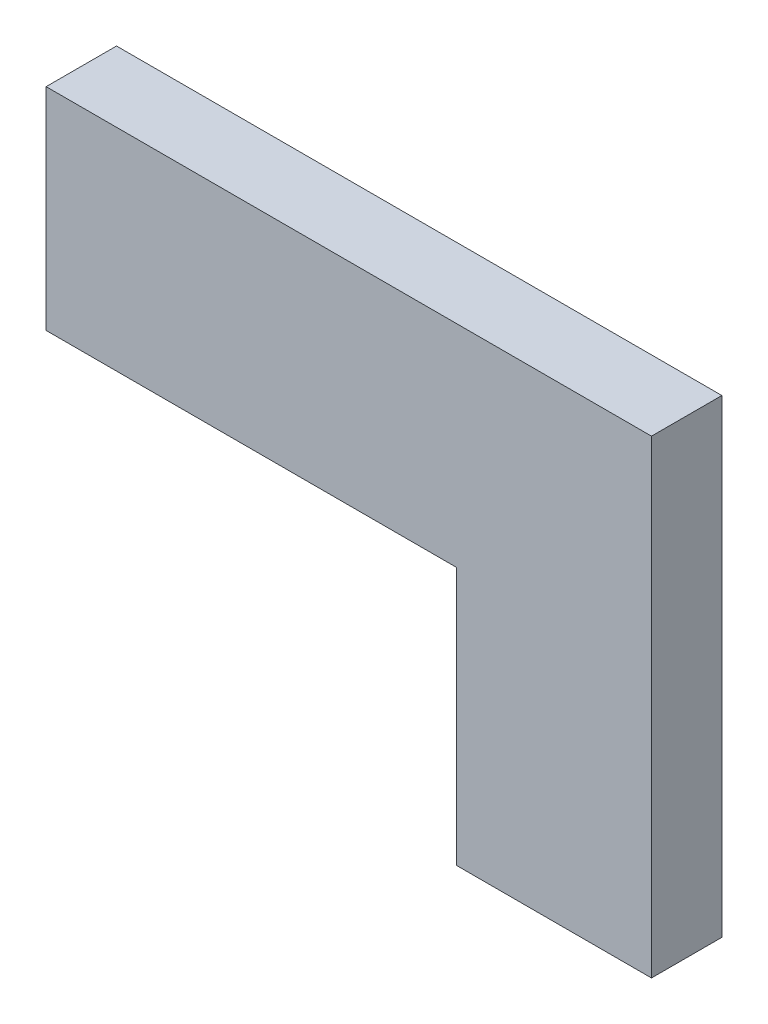
ISO-10303-21;
HEADER;
FILE_DESCRIPTION(('STEP AP214'),'2;1');
FILE_NAME('part.step','',(''),(''),'','','');
FILE_SCHEMA(('AUTOMOTIVE_DESIGN { 1 0 10303 214 1 1 1 1 }'));
ENDSEC;
DATA;
#1=APPLICATION_CONTEXT('core data for automotive mechanical design processes');
#2=APPLICATION_PROTOCOL_DEFINITION('international standard','automotive_design',2000,#1);
#3=PRODUCT_CONTEXT('',#1,'mechanical');
#4=PRODUCT('Part','Part','',(#3));
#5=PRODUCT_RELATED_PRODUCT_CATEGORY('part','',(#4));
#6=PRODUCT_DEFINITION_FORMATION('','',#4);
#7=PRODUCT_DEFINITION_CONTEXT('part definition',#1,'design');
#8=PRODUCT_DEFINITION('design','',#6,#7);
#9=PRODUCT_DEFINITION_SHAPE('','',#8);
#10=(LENGTH_UNIT() NAMED_UNIT(*) SI_UNIT(.MILLI.,.METRE.));
#11=(NAMED_UNIT(*) PLANE_ANGLE_UNIT() SI_UNIT($,.RADIAN.));
#12=(NAMED_UNIT(*) SI_UNIT($,.STERADIAN.) SOLID_ANGLE_UNIT());
#13=UNCERTAINTY_MEASURE_WITH_UNIT(LENGTH_MEASURE(1.E-05),#10,'distance_accuracy_value','');
#14=(GEOMETRIC_REPRESENTATION_CONTEXT(3) GLOBAL_UNCERTAINTY_ASSIGNED_CONTEXT((#13)) GLOBAL_UNIT_ASSIGNED_CONTEXT((#10,
#11,#12)) REPRESENTATION_CONTEXT('',''));
#15=CARTESIAN_POINT('',(0.,0.,0.));
#16=DIRECTION('',(0.,0.,1.));
#17=DIRECTION('',(1.,0.,0.));
#18=AXIS2_PLACEMENT_3D('',#15,#16,#17);
#19=CARTESIAN_POINT('',(-2.50000000000001,202.5,356.441418940673));
#20=DIRECTION('',(1.,0.,0.));
#21=DIRECTION('',(0.,1.,0.));
#22=AXIS2_PLACEMENT_3D('',#19,#20,#21);
#23=PLANE('',#22);
#24=DIRECTION('',(0.,-1.,0.));
#25=VECTOR('',#24,1.);
#26=CARTESIAN_POINT('',(-2.50000000000001,202.5,30.));
#27=LINE('',#26,#25);
#28=CARTESIAN_POINT('',(-2.50000000000001,202.5,30.));
#29=VERTEX_POINT('',#28);
#30=CARTESIAN_POINT('',(-2.5,112.5,30.));
#31=VERTEX_POINT('',#30);
#32=EDGE_CURVE('E114',#29,#31,#27,.T.);
#33=ORIENTED_EDGE('',*,*,#32,.F.);
#34=DIRECTION('',(0.,0.,-1.));
#35=VECTOR('',#34,1.);
#36=CARTESIAN_POINT('',(-2.50000000000001,202.5,356.441418940673));
#37=LINE('',#36,#35);
#38=CARTESIAN_POINT('',(-2.50000000000001,202.5,0.));
#39=VERTEX_POINT('',#38);
#40=EDGE_CURVE('E37',#29,#39,#37,.T.);
#41=ORIENTED_EDGE('',*,*,#40,.T.);
#42=DIRECTION('',(0.,-1.,0.));
#43=VECTOR('',#42,1.);
#44=CARTESIAN_POINT('',(-2.50000000000001,202.5,0.));
#45=LINE('',#44,#43);
#46=CARTESIAN_POINT('',(-2.5,112.5,0.));
#47=VERTEX_POINT('',#46);
#48=EDGE_CURVE('E122',#39,#47,#45,.T.);
#49=ORIENTED_EDGE('',*,*,#48,.T.);
#50=DIRECTION('',(0.,0.,-1.));
#51=VECTOR('',#50,1.);
#52=CARTESIAN_POINT('',(-2.5,112.5,356.441418940673));
#53=LINE('',#52,#51);
#54=EDGE_CURVE('E80',#31,#47,#53,.T.);
#55=ORIENTED_EDGE('',*,*,#54,.F.);
#56=EDGE_LOOP('',(#33,#41,#49,#55));
#57=FACE_BOUND('',#56,.T.);
#58=ADVANCED_FACE('F33',(#57),#23,.F.);
#59=CARTESIAN_POINT('',(-2.5,112.5,356.441418940673));
#60=DIRECTION('',(0.,1.,0.));
#61=DIRECTION('',(0.,0.,1.));
#62=AXIS2_PLACEMENT_3D('',#59,#60,#61);
#63=PLANE('',#62);
#64=DIRECTION('',(1.,0.,0.));
#65=VECTOR('',#64,1.);
#66=CARTESIAN_POINT('',(-2.5,112.5,30.));
#67=LINE('',#66,#65);
#68=CARTESIAN_POINT('',(172.5,112.5,30.));
#69=VERTEX_POINT('',#68);
#70=EDGE_CURVE('E87',#31,#69,#67,.T.);
#71=ORIENTED_EDGE('',*,*,#70,.F.);
#72=ORIENTED_EDGE('',*,*,#54,.T.);
#73=DIRECTION('',(1.,0.,0.));
#74=VECTOR('',#73,1.);
#75=CARTESIAN_POINT('',(-2.5,112.5,0.));
#76=LINE('',#75,#74);
#77=CARTESIAN_POINT('',(172.5,112.5,0.));
#78=VERTEX_POINT('',#77);
#79=EDGE_CURVE('E121',#47,#78,#76,.T.);
#80=ORIENTED_EDGE('',*,*,#79,.T.);
#81=DIRECTION('',(0.,0.,-1.));
#82=VECTOR('',#81,1.);
#83=CARTESIAN_POINT('',(172.5,112.5,356.441418940673));
#84=LINE('',#83,#82);
#85=EDGE_CURVE('E123',#69,#78,#84,.T.);
#86=ORIENTED_EDGE('',*,*,#85,.F.);
#87=EDGE_LOOP('',(#71,#72,#80,#86));
#88=FACE_BOUND('',#87,.T.);
#89=ADVANCED_FACE('F141',(#88),#63,.F.);
#90=CARTESIAN_POINT('',(172.5,2.50000000000002,356.441418940673));
#91=DIRECTION('',(1.,0.,0.));
#92=DIRECTION('',(0.,0.,-1.));
#93=AXIS2_PLACEMENT_3D('',#90,#91,#92);
#94=PLANE('',#93);
#95=DIRECTION('',(0.,-1.,0.));
#96=VECTOR('',#95,1.);
#97=CARTESIAN_POINT('',(172.5,2.50000000000006,30.));
#98=LINE('',#97,#96);
#99=CARTESIAN_POINT('',(172.5,2.50000000000002,30.));
#100=VERTEX_POINT('',#99);
#101=EDGE_CURVE('E108',#69,#100,#98,.T.);
#102=ORIENTED_EDGE('',*,*,#101,.F.);
#103=ORIENTED_EDGE('',*,*,#85,.T.);
#104=DIRECTION('',(0.,-1.,0.));
#105=VECTOR('',#104,1.);
#106=CARTESIAN_POINT('',(172.5,2.50000000000002,0.));
#107=LINE('',#106,#105);
#108=CARTESIAN_POINT('',(172.5,2.50000000000002,0.));
#109=VERTEX_POINT('',#108);
#110=EDGE_CURVE('E125',#78,#109,#107,.T.);
#111=ORIENTED_EDGE('',*,*,#110,.T.);
#112=DIRECTION('',(0.,0.,-1.));
#113=VECTOR('',#112,1.);
#114=CARTESIAN_POINT('',(172.5,2.50000000000002,356.441418940673));
#115=LINE('',#114,#113);
#116=EDGE_CURVE('E126',#100,#109,#115,.T.);
#117=ORIENTED_EDGE('',*,*,#116,.F.);
#118=EDGE_LOOP('',(#102,#103,#111,#117));
#119=FACE_BOUND('',#118,.T.);
#120=ADVANCED_FACE('F143',(#119),#94,.F.);
#121=CARTESIAN_POINT('',(255.5,2.50000000000002,356.441418940673));
#122=DIRECTION('',(0.,1.,0.));
#123=DIRECTION('',(-1.,0.,0.));
#124=AXIS2_PLACEMENT_3D('',#121,#122,#123);
#125=PLANE('',#124);
#126=DIRECTION('',(1.,0.,0.));
#127=VECTOR('',#126,1.);
#128=CARTESIAN_POINT('',(255.5,2.50000000000002,30.));
#129=LINE('',#128,#127);
#130=CARTESIAN_POINT('',(255.5,2.50000000000002,30.));
#131=VERTEX_POINT('',#130);
#132=EDGE_CURVE('E42',#100,#131,#129,.T.);
#133=ORIENTED_EDGE('',*,*,#132,.F.);
#134=ORIENTED_EDGE('',*,*,#116,.T.);
#135=DIRECTION('',(1.,0.,0.));
#136=VECTOR('',#135,1.);
#137=CARTESIAN_POINT('',(255.5,2.50000000000002,0.));
#138=LINE('',#137,#136);
#139=CARTESIAN_POINT('',(255.5,2.50000000000002,0.));
#140=VERTEX_POINT('',#139);
#141=EDGE_CURVE('E103',#109,#140,#138,.T.);
#142=ORIENTED_EDGE('',*,*,#141,.T.);
#143=DIRECTION('',(0.,0.,-1.));
#144=VECTOR('',#143,1.);
#145=CARTESIAN_POINT('',(255.5,2.50000000000002,356.441418940673));
#146=LINE('',#145,#144);
#147=EDGE_CURVE('E94',#131,#140,#146,.T.);
#148=ORIENTED_EDGE('',*,*,#147,.F.);
#149=EDGE_LOOP('',(#133,#134,#142,#148));
#150=FACE_BOUND('',#149,.T.);
#151=ADVANCED_FACE('F100',(#150),#125,.F.);
#152=CARTESIAN_POINT('',(255.5,2.50000000000002,356.441418940673));
#153=DIRECTION('',(-1.,0.,0.));
#154=DIRECTION('',(0.,0.,1.));
#155=AXIS2_PLACEMENT_3D('',#152,#153,#154);
#156=PLANE('',#155);
#157=DIRECTION('',(0.,1.,0.));
#158=VECTOR('',#157,1.);
#159=CARTESIAN_POINT('',(255.5,2.50000000000006,30.));
#160=LINE('',#159,#158);
#161=CARTESIAN_POINT('',(255.5,202.5,30.));
#162=VERTEX_POINT('',#161);
#163=EDGE_CURVE('E11',#131,#162,#160,.T.);
#164=ORIENTED_EDGE('',*,*,#163,.F.);
#165=ORIENTED_EDGE('',*,*,#147,.T.);
#166=DIRECTION('',(0.,1.,0.));
#167=VECTOR('',#166,1.);
#168=CARTESIAN_POINT('',(255.5,2.50000000000002,0.));
#169=LINE('',#168,#167);
#170=CARTESIAN_POINT('',(255.5,202.5,0.));
#171=VERTEX_POINT('',#170);
#172=EDGE_CURVE('E105',#140,#171,#169,.T.);
#173=ORIENTED_EDGE('',*,*,#172,.T.);
#174=DIRECTION('',(0.,0.,-1.));
#175=VECTOR('',#174,1.);
#176=CARTESIAN_POINT('',(255.5,202.5,356.441418940673));
#177=LINE('',#176,#175);
#178=EDGE_CURVE('E55',#162,#171,#177,.T.);
#179=ORIENTED_EDGE('',*,*,#178,.F.);
#180=EDGE_LOOP('',(#164,#165,#173,#179));
#181=FACE_BOUND('',#180,.T.);
#182=ADVANCED_FACE('F93',(#181),#156,.F.);
#183=CARTESIAN_POINT('',(-2.50000000000001,202.5,356.441418940673));
#184=DIRECTION('',(0.,-1.,0.));
#185=DIRECTION('',(0.,0.,-1.));
#186=AXIS2_PLACEMENT_3D('',#183,#184,#185);
#187=PLANE('',#186);
#188=DIRECTION('',(-1.,0.,0.));
#189=VECTOR('',#188,1.);
#190=CARTESIAN_POINT('',(-2.50000000000001,202.5,30.));
#191=LINE('',#190,#189);
#192=EDGE_CURVE('E117',#162,#29,#191,.T.);
#193=ORIENTED_EDGE('',*,*,#192,.F.);
#194=ORIENTED_EDGE('',*,*,#178,.T.);
#195=DIRECTION('',(-1.,0.,0.));
#196=VECTOR('',#195,1.);
#197=CARTESIAN_POINT('',(-2.50000000000001,202.5,0.));
#198=LINE('',#197,#196);
#199=EDGE_CURVE('E119',#171,#39,#198,.T.);
#200=ORIENTED_EDGE('',*,*,#199,.T.);
#201=ORIENTED_EDGE('',*,*,#40,.F.);
#202=EDGE_LOOP('',(#193,#194,#200,#201));
#203=FACE_BOUND('',#202,.T.);
#204=ADVANCED_FACE('F137',(#203),#187,.F.);
#205=CARTESIAN_POINT('',(0.,0.,0.));
#206=DIRECTION('',(0.,0.,1.));
#207=DIRECTION('',(1.,0.,0.));
#208=AXIS2_PLACEMENT_3D('',#205,#206,#207);
#209=PLANE('',#208);
#210=ORIENTED_EDGE('',*,*,#48,.F.);
#211=ORIENTED_EDGE('',*,*,#199,.F.);
#212=ORIENTED_EDGE('',*,*,#172,.F.);
#213=ORIENTED_EDGE('',*,*,#141,.F.);
#214=ORIENTED_EDGE('',*,*,#110,.F.);
#215=ORIENTED_EDGE('',*,*,#79,.F.);
#216=EDGE_LOOP('',(#210,#211,#212,#213,#214,#215));
#217=FACE_BOUND('',#216,.T.);
#218=ADVANCED_FACE('F139',(#217),#209,.F.);
#219=CARTESIAN_POINT('',(-119.292856898255,52.,30.));
#220=DIRECTION('',(0.,0.,1.));
#221=DIRECTION('',(0.,-1.,0.));
#222=AXIS2_PLACEMENT_3D('',#219,#220,#221);
#223=PLANE('',#222);
#224=ORIENTED_EDGE('',*,*,#192,.T.);
#225=ORIENTED_EDGE('',*,*,#32,.T.);
#226=ORIENTED_EDGE('',*,*,#70,.T.);
#227=ORIENTED_EDGE('',*,*,#101,.T.);
#228=ORIENTED_EDGE('',*,*,#132,.T.);
#229=ORIENTED_EDGE('',*,*,#163,.T.);
#230=EDGE_LOOP('',(#224,#225,#226,#227,#228,#229));
#231=FACE_BOUND('',#230,.T.);
#232=ADVANCED_FACE('F35',(#231),#223,.T.);
#233=CLOSED_SHELL('',(#58,#89,#120,#151,#182,#204,#218,#232));
#234=MANIFOLD_SOLID_BREP('B2',#233);
#235=ADVANCED_BREP_SHAPE_REPRESENTATION('',(#18,#234),#14);
#236=SHAPE_DEFINITION_REPRESENTATION(#9,#235);
ENDSEC;
END-ISO-10303-21;
